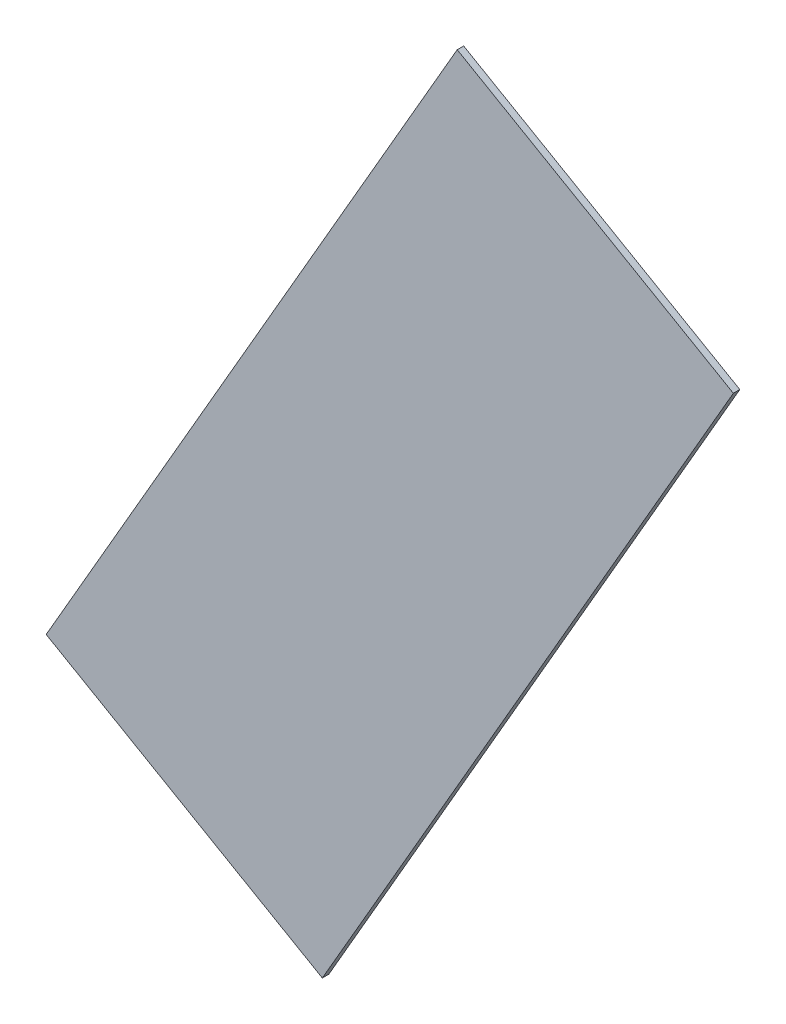
ISO-10303-21;
HEADER;
FILE_DESCRIPTION(('STEP AP214'),'2;1');
FILE_NAME('part.step','',(''),(''),'','','');
FILE_SCHEMA(('AUTOMOTIVE_DESIGN { 1 0 10303 214 1 1 1 1 }'));
ENDSEC;
DATA;
#1=APPLICATION_CONTEXT('core data for automotive mechanical design processes');
#2=APPLICATION_PROTOCOL_DEFINITION('international standard','automotive_design',2000,#1);
#3=PRODUCT_CONTEXT('',#1,'mechanical');
#4=PRODUCT('Part','Part','',(#3));
#5=PRODUCT_RELATED_PRODUCT_CATEGORY('part','',(#4));
#6=PRODUCT_DEFINITION_FORMATION('','',#4);
#7=PRODUCT_DEFINITION_CONTEXT('part definition',#1,'design');
#8=PRODUCT_DEFINITION('design','',#6,#7);
#9=PRODUCT_DEFINITION_SHAPE('','',#8);
#10=(LENGTH_UNIT() NAMED_UNIT(*) SI_UNIT(.MILLI.,.METRE.));
#11=(NAMED_UNIT(*) PLANE_ANGLE_UNIT() SI_UNIT($,.RADIAN.));
#12=(NAMED_UNIT(*) SI_UNIT($,.STERADIAN.) SOLID_ANGLE_UNIT());
#13=UNCERTAINTY_MEASURE_WITH_UNIT(LENGTH_MEASURE(1.E-05),#10,'distance_accuracy_value','');
#14=(GEOMETRIC_REPRESENTATION_CONTEXT(3) GLOBAL_UNCERTAINTY_ASSIGNED_CONTEXT((#13)) GLOBAL_UNIT_ASSIGNED_CONTEXT((#10,
#11,#12)) REPRESENTATION_CONTEXT('',''));
#15=CARTESIAN_POINT('',(0.,0.,0.));
#16=DIRECTION('',(0.,0.,1.));
#17=DIRECTION('',(1.,0.,0.));
#18=AXIS2_PLACEMENT_3D('',#15,#16,#17);
#19=CARTESIAN_POINT('',(0.,0.,1.635));
#20=DIRECTION('',(0.,0.,1.));
#21=DIRECTION('',(1.,0.,0.));
#22=AXIS2_PLACEMENT_3D('',#19,#20,#21);
#23=PLANE('',#22);
#24=DIRECTION('',(0.866025411219667,-0.499999987121807,0.));
#25=VECTOR('',#24,1.);
#26=CARTESIAN_POINT('',(6.219004,-1.016261,1.635));
#27=LINE('',#26,#25);
#28=CARTESIAN_POINT('',(6.219004,-1.016261,1.635));
#29=VERTEX_POINT('',#28);
#30=CARTESIAN_POINT('',(7.717228,-1.881261,1.635));
#31=VERTEX_POINT('',#30);
#32=EDGE_CURVE('E25',#29,#31,#27,.T.);
#33=ORIENTED_EDGE('',*,*,#32,.F.);
#34=DIRECTION('',(0.499999932123854,0.866025442972747,0.));
#35=VECTOR('',#34,1.);
#36=CARTESIAN_POINT('',(3.989004,-4.878735,1.635));
#37=LINE('',#36,#35);
#38=CARTESIAN_POINT('',(3.989004,-4.878735,1.635));
#39=VERTEX_POINT('',#38);
#40=EDGE_CURVE('E110',#39,#29,#37,.T.);
#41=ORIENTED_EDGE('',*,*,#40,.F.);
#42=DIRECTION('',(-0.866025411219667,0.499999987121807,0.));
#43=VECTOR('',#42,1.);
#44=CARTESIAN_POINT('',(5.487228,-5.743735,1.635));
#45=LINE('',#44,#43);
#46=CARTESIAN_POINT('',(5.487228,-5.743735,1.635));
#47=VERTEX_POINT('',#46);
#48=EDGE_CURVE('E77',#47,#39,#45,.T.);
#49=ORIENTED_EDGE('',*,*,#48,.F.);
#50=DIRECTION('',(-0.499999932123854,-0.866025442972747,0.));
#51=VECTOR('',#50,1.);
#52=CARTESIAN_POINT('',(7.717228,-1.881261,1.635));
#53=LINE('',#52,#51);
#54=EDGE_CURVE('E75',#31,#47,#53,.T.);
#55=ORIENTED_EDGE('',*,*,#54,.F.);
#56=EDGE_LOOP('',(#33,#41,#49,#55));
#57=FACE_BOUND('',#56,.T.);
#58=ADVANCED_FACE('F17',(#57),#23,.T.);
#59=CARTESIAN_POINT('',(0.,0.,1.6));
#60=DIRECTION('',(0.,0.,1.));
#61=DIRECTION('',(1.,0.,0.));
#62=AXIS2_PLACEMENT_3D('',#59,#60,#61);
#63=PLANE('',#62);
#64=DIRECTION('',(-0.499999932123854,-0.866025442972747,0.));
#65=VECTOR('',#64,1.);
#66=CARTESIAN_POINT('',(7.717228,-1.881261,1.6));
#67=LINE('',#66,#65);
#68=CARTESIAN_POINT('',(7.717228,-1.881261,1.6));
#69=VERTEX_POINT('',#68);
#70=CARTESIAN_POINT('',(5.487228,-5.743735,1.6));
#71=VERTEX_POINT('',#70);
#72=EDGE_CURVE('E87',#69,#71,#67,.T.);
#73=ORIENTED_EDGE('',*,*,#72,.T.);
#74=DIRECTION('',(-0.866025411219667,0.499999987121807,0.));
#75=VECTOR('',#74,1.);
#76=CARTESIAN_POINT('',(5.487228,-5.743735,1.6));
#77=LINE('',#76,#75);
#78=CARTESIAN_POINT('',(3.989004,-4.878735,1.6));
#79=VERTEX_POINT('',#78);
#80=EDGE_CURVE('E106',#71,#79,#77,.T.);
#81=ORIENTED_EDGE('',*,*,#80,.T.);
#82=DIRECTION('',(0.499999932123854,0.866025442972747,0.));
#83=VECTOR('',#82,1.);
#84=CARTESIAN_POINT('',(3.989004,-4.878735,1.6));
#85=LINE('',#84,#83);
#86=CARTESIAN_POINT('',(6.219004,-1.016261,1.6));
#87=VERTEX_POINT('',#86);
#88=EDGE_CURVE('E73',#79,#87,#85,.T.);
#89=ORIENTED_EDGE('',*,*,#88,.T.);
#90=DIRECTION('',(0.866025411219667,-0.499999987121807,0.));
#91=VECTOR('',#90,1.);
#92=CARTESIAN_POINT('',(6.219004,-1.016261,1.6));
#93=LINE('',#92,#91);
#94=EDGE_CURVE('E11',#87,#69,#93,.T.);
#95=ORIENTED_EDGE('',*,*,#94,.T.);
#96=EDGE_LOOP('',(#73,#81,#89,#95));
#97=FACE_BOUND('',#96,.T.);
#98=ADVANCED_FACE('F169',(#97),#63,.F.);
#99=CARTESIAN_POINT('',(6.219004,-1.016261,1.6));
#100=DIRECTION('',(0.499999987121807,0.866025411219667,0.));
#101=DIRECTION('',(0.,0.,-1.));
#102=AXIS2_PLACEMENT_3D('',#99,#100,#101);
#103=PLANE('',#102);
#104=DIRECTION('',(0.,0.,1.));
#105=VECTOR('',#104,1.);
#106=CARTESIAN_POINT('',(6.219004,-1.016261,1.6));
#107=LINE('',#106,#105);
#108=EDGE_CURVE('E70',#87,#29,#107,.T.);
#109=ORIENTED_EDGE('',*,*,#108,.T.);
#110=ORIENTED_EDGE('',*,*,#32,.T.);
#111=DIRECTION('',(0.,0.,1.));
#112=VECTOR('',#111,1.);
#113=CARTESIAN_POINT('',(7.717228,-1.881261,1.6));
#114=LINE('',#113,#112);
#115=EDGE_CURVE('E68',#69,#31,#114,.T.);
#116=ORIENTED_EDGE('',*,*,#115,.F.);
#117=ORIENTED_EDGE('',*,*,#94,.F.);
#118=EDGE_LOOP('',(#109,#110,#116,#117));
#119=FACE_BOUND('',#118,.T.);
#120=ADVANCED_FACE('F66',(#119),#103,.T.);
#121=CARTESIAN_POINT('',(3.989004,-4.878735,1.6));
#122=DIRECTION('',(-0.866025442972747,0.499999932123854,0.));
#123=DIRECTION('',(0.,0.,1.));
#124=AXIS2_PLACEMENT_3D('',#121,#122,#123);
#125=PLANE('',#124);
#126=DIRECTION('',(0.,0.,1.));
#127=VECTOR('',#126,1.);
#128=CARTESIAN_POINT('',(3.989004,-4.878735,1.6));
#129=LINE('',#128,#127);
#130=EDGE_CURVE('E102',#79,#39,#129,.T.);
#131=ORIENTED_EDGE('',*,*,#130,.T.);
#132=ORIENTED_EDGE('',*,*,#40,.T.);
#133=ORIENTED_EDGE('',*,*,#108,.F.);
#134=ORIENTED_EDGE('',*,*,#88,.F.);
#135=EDGE_LOOP('',(#131,#132,#133,#134));
#136=FACE_BOUND('',#135,.T.);
#137=ADVANCED_FACE('F149',(#136),#125,.T.);
#138=CARTESIAN_POINT('',(5.487228,-5.743735,1.6));
#139=DIRECTION('',(-0.499999987121807,-0.866025411219667,0.));
#140=DIRECTION('',(-0.866025411219667,0.499999987121807,0.));
#141=AXIS2_PLACEMENT_3D('',#138,#139,#140);
#142=PLANE('',#141);
#143=DIRECTION('',(0.,0.,1.));
#144=VECTOR('',#143,1.);
#145=CARTESIAN_POINT('',(5.487228,-5.743735,1.6));
#146=LINE('',#145,#144);
#147=EDGE_CURVE('E82',#71,#47,#146,.T.);
#148=ORIENTED_EDGE('',*,*,#147,.T.);
#149=ORIENTED_EDGE('',*,*,#48,.T.);
#150=ORIENTED_EDGE('',*,*,#130,.F.);
#151=ORIENTED_EDGE('',*,*,#80,.F.);
#152=EDGE_LOOP('',(#148,#149,#150,#151));
#153=FACE_BOUND('',#152,.T.);
#154=ADVANCED_FACE('F137',(#153),#142,.T.);
#155=CARTESIAN_POINT('',(7.717228,-1.881261,1.6));
#156=DIRECTION('',(0.866025442972747,-0.499999932123854,0.));
#157=DIRECTION('',(0.,0.,-1.));
#158=AXIS2_PLACEMENT_3D('',#155,#156,#157);
#159=PLANE('',#158);
#160=ORIENTED_EDGE('',*,*,#115,.T.);
#161=ORIENTED_EDGE('',*,*,#54,.T.);
#162=ORIENTED_EDGE('',*,*,#147,.F.);
#163=ORIENTED_EDGE('',*,*,#72,.F.);
#164=EDGE_LOOP('',(#160,#161,#162,#163));
#165=FACE_BOUND('',#164,.T.);
#166=ADVANCED_FACE('F85',(#165),#159,.T.);
#167=CLOSED_SHELL('',(#58,#98,#120,#137,#154,#166));
#168=MANIFOLD_SOLID_BREP('B1',#167);
#169=ADVANCED_BREP_SHAPE_REPRESENTATION('',(#18,#168),#14);
#170=SHAPE_DEFINITION_REPRESENTATION(#9,#169);
ENDSEC;
END-ISO-10303-21;
